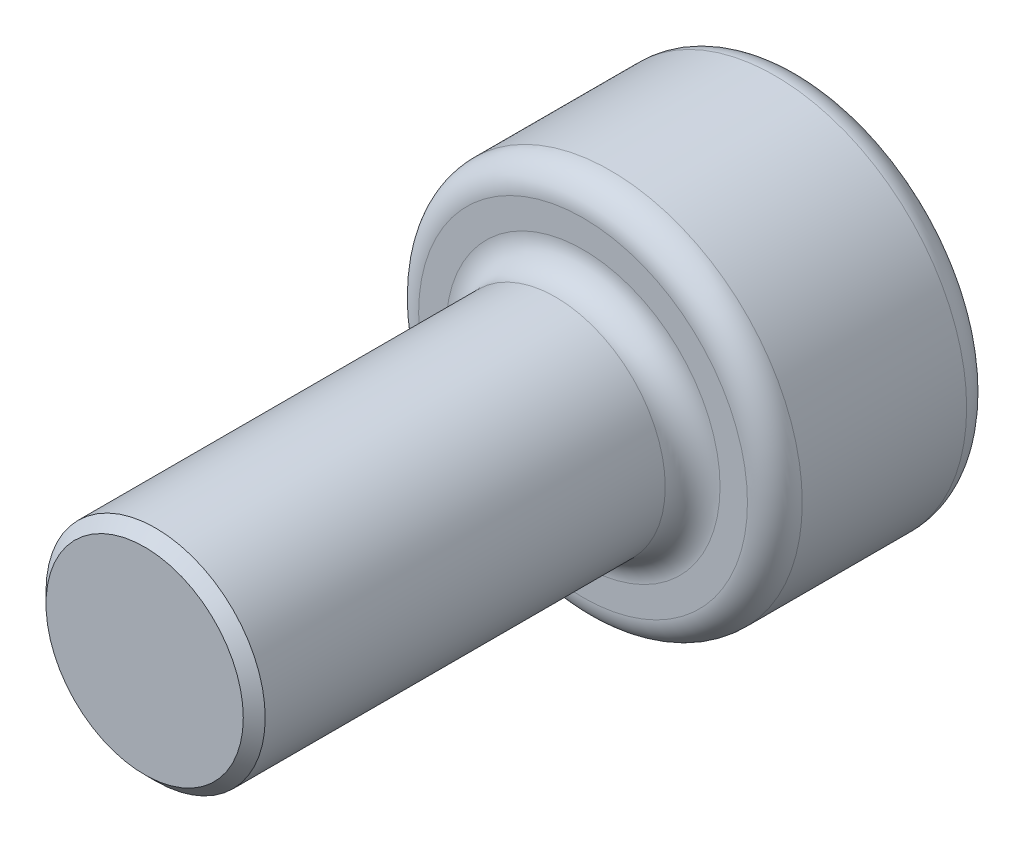
ISO-10303-21;
HEADER;
FILE_DESCRIPTION(('STEP AP214'),'2;1');
FILE_NAME('part.step','',(''),(''),'','','');
FILE_SCHEMA(('AUTOMOTIVE_DESIGN { 1 0 10303 214 1 1 1 1 }'));
ENDSEC;
DATA;
#1=APPLICATION_CONTEXT('core data for automotive mechanical design processes');
#2=APPLICATION_PROTOCOL_DEFINITION('international standard','automotive_design',2000,#1);
#3=PRODUCT_CONTEXT('',#1,'mechanical');
#4=PRODUCT('Part','Part','',(#3));
#5=PRODUCT_RELATED_PRODUCT_CATEGORY('part','',(#4));
#6=PRODUCT_DEFINITION_FORMATION('','',#4);
#7=PRODUCT_DEFINITION_CONTEXT('part definition',#1,'design');
#8=PRODUCT_DEFINITION('design','',#6,#7);
#9=PRODUCT_DEFINITION_SHAPE('','',#8);
#10=(LENGTH_UNIT() NAMED_UNIT(*) SI_UNIT(.MILLI.,.METRE.));
#11=(NAMED_UNIT(*) PLANE_ANGLE_UNIT() SI_UNIT($,.RADIAN.));
#12=(NAMED_UNIT(*) SI_UNIT($,.STERADIAN.) SOLID_ANGLE_UNIT());
#13=UNCERTAINTY_MEASURE_WITH_UNIT(LENGTH_MEASURE(1.E-05),#10,'distance_accuracy_value','');
#14=(GEOMETRIC_REPRESENTATION_CONTEXT(3) GLOBAL_UNCERTAINTY_ASSIGNED_CONTEXT((#13)) GLOBAL_UNIT_ASSIGNED_CONTEXT((#10,
#11,#12)) REPRESENTATION_CONTEXT('',''));
#15=CARTESIAN_POINT('',(0.,0.,0.));
#16=DIRECTION('',(0.,0.,1.));
#17=DIRECTION('',(1.,0.,0.));
#18=AXIS2_PLACEMENT_3D('',#15,#16,#17);
#19=CARTESIAN_POINT('',(0.,0.,4.));
#20=DIRECTION('',(0.,0.,-1.));
#21=DIRECTION('',(-1.,0.,0.));
#22=AXIS2_PLACEMENT_3D('',#19,#20,#21);
#23=CYLINDRICAL_SURFACE('',#22,3.5);
#24=CARTESIAN_POINT('',(0.,0.,3.5));
#25=DIRECTION('',(0.,0.,1.));
#26=DIRECTION('',(1.,0.,0.));
#27=AXIS2_PLACEMENT_3D('',#24,#25,#26);
#28=CIRCLE('',#27,3.5);
#29=CARTESIAN_POINT('',(3.5,0.,3.5));
#30=VERTEX_POINT('',#29);
#31=EDGE_CURVE('E185',#30,#30,#28,.F.);
#32=ORIENTED_EDGE('',*,*,#31,.T.);
#33=EDGE_LOOP('',(#32));
#34=FACE_BOUND('',#33,.T.);
#35=CARTESIAN_POINT('',(0.,0.,0.5));
#36=DIRECTION('',(0.,0.,1.));
#37=DIRECTION('',(1.,0.,0.));
#38=AXIS2_PLACEMENT_3D('',#35,#36,#37);
#39=CIRCLE('',#38,3.5);
#40=CARTESIAN_POINT('',(3.5,0.,0.5));
#41=VERTEX_POINT('',#40);
#42=EDGE_CURVE('E181',#41,#41,#39,.T.);
#43=ORIENTED_EDGE('',*,*,#42,.T.);
#44=EDGE_LOOP('',(#43));
#45=FACE_BOUND('',#44,.T.);
#46=ADVANCED_FACE('F41',(#34,#45),#23,.T.);
#47=CARTESIAN_POINT('',(0.,0.,4.));
#48=DIRECTION('',(0.,0.,1.));
#49=DIRECTION('',(1.,0.,0.));
#50=AXIS2_PLACEMENT_3D('',#47,#48,#49);
#51=PLANE('',#50);
#52=CARTESIAN_POINT('',(0.,0.,4.));
#53=DIRECTION('',(0.,0.,1.));
#54=DIRECTION('',(1.,0.,0.));
#55=AXIS2_PLACEMENT_3D('',#52,#53,#54);
#56=CIRCLE('',#55,3.);
#57=CARTESIAN_POINT('',(3.,0.,4.));
#58=VERTEX_POINT('',#57);
#59=EDGE_CURVE('E177',#58,#58,#56,.T.);
#60=ORIENTED_EDGE('',*,*,#59,.T.);
#61=EDGE_LOOP('',(#60));
#62=FACE_BOUND('',#61,.T.);
#63=CARTESIAN_POINT('',(0.,0.,4.));
#64=DIRECTION('',(0.,0.,1.));
#65=DIRECTION('',(1.,0.,0.));
#66=AXIS2_PLACEMENT_3D('',#63,#64,#65);
#67=CIRCLE('',#66,2.5);
#68=CARTESIAN_POINT('',(2.5,0.,4.));
#69=VERTEX_POINT('',#68);
#70=EDGE_CURVE('E160',#69,#69,#67,.F.);
#71=ORIENTED_EDGE('',*,*,#70,.T.);
#72=EDGE_LOOP('',(#71));
#73=FACE_BOUND('',#72,.T.);
#74=ADVANCED_FACE('F266',(#62,#73),#51,.T.);
#75=CARTESIAN_POINT('',(0.,0.,0.));
#76=DIRECTION('',(0.,0.,1.));
#77=DIRECTION('',(1.,0.,0.));
#78=AXIS2_PLACEMENT_3D('',#75,#76,#77);
#79=PLANE('',#78);
#80=CARTESIAN_POINT('',(0.,0.,0.));
#81=DIRECTION('',(0.,0.,1.));
#82=DIRECTION('',(1.,0.,0.));
#83=AXIS2_PLACEMENT_3D('',#80,#81,#82);
#84=CIRCLE('',#83,3.);
#85=CARTESIAN_POINT('',(3.,0.,0.));
#86=VERTEX_POINT('',#85);
#87=EDGE_CURVE('E212',#86,#86,#84,.F.);
#88=ORIENTED_EDGE('',*,*,#87,.T.);
#89=EDGE_LOOP('',(#88));
#90=FACE_BOUND('',#89,.T.);
#91=DIRECTION('',(0.5,-0.866025403784439,0.));
#92=VECTOR('',#91,1.);
#93=CARTESIAN_POINT('',(1.94855715851499,1.125,0.));
#94=LINE('',#93,#92);
#95=CARTESIAN_POINT('',(2.59807621135332,0.,0.));
#96=VERTEX_POINT('',#95);
#97=CARTESIAN_POINT('',(1.29903810567666,2.25,0.));
#98=VERTEX_POINT('',#97);
#99=EDGE_CURVE('E205',#96,#98,#94,.F.);
#100=ORIENTED_EDGE('',*,*,#99,.T.);
#101=DIRECTION('',(1.,0.,0.));
#102=VECTOR('',#101,1.);
#103=CARTESIAN_POINT('',(0.,2.25,0.));
#104=LINE('',#103,#102);
#105=CARTESIAN_POINT('',(-1.29903810567666,2.25,0.));
#106=VERTEX_POINT('',#105);
#107=EDGE_CURVE('E208',#98,#106,#104,.F.);
#108=ORIENTED_EDGE('',*,*,#107,.T.);
#109=DIRECTION('',(0.5,0.866025403784439,0.));
#110=VECTOR('',#109,1.);
#111=CARTESIAN_POINT('',(-1.94855715851499,1.125,0.));
#112=LINE('',#111,#110);
#113=CARTESIAN_POINT('',(-2.59807621135332,0.,0.));
#114=VERTEX_POINT('',#113);
#115=EDGE_CURVE('E193',#106,#114,#112,.F.);
#116=ORIENTED_EDGE('',*,*,#115,.T.);
#117=DIRECTION('',(-0.5,0.866025403784439,0.));
#118=VECTOR('',#117,1.);
#119=CARTESIAN_POINT('',(-1.94855715851499,-1.125,0.));
#120=LINE('',#119,#118);
#121=CARTESIAN_POINT('',(-1.29903810567666,-2.25,0.));
#122=VERTEX_POINT('',#121);
#123=EDGE_CURVE('E196',#114,#122,#120,.F.);
#124=ORIENTED_EDGE('',*,*,#123,.T.);
#125=DIRECTION('',(-1.,0.,0.));
#126=VECTOR('',#125,1.);
#127=CARTESIAN_POINT('',(0.,-2.25,0.));
#128=LINE('',#127,#126);
#129=CARTESIAN_POINT('',(1.29903810567666,-2.25,0.));
#130=VERTEX_POINT('',#129);
#131=EDGE_CURVE('E199',#122,#130,#128,.F.);
#132=ORIENTED_EDGE('',*,*,#131,.T.);
#133=DIRECTION('',(-0.5,-0.866025403784439,0.));
#134=VECTOR('',#133,1.);
#135=CARTESIAN_POINT('',(1.94855715851499,-1.125,0.));
#136=LINE('',#135,#134);
#137=EDGE_CURVE('E202',#130,#96,#136,.F.);
#138=ORIENTED_EDGE('',*,*,#137,.T.);
#139=EDGE_LOOP('',(#100,#108,#116,#124,#132,#138));
#140=FACE_BOUND('',#139,.T.);
#141=ADVANCED_FACE('F272',(#90,#140),#79,.F.);
#142=CARTESIAN_POINT('',(0.,0.,12.));
#143=DIRECTION('',(0.,0.,-1.));
#144=DIRECTION('',(-1.,0.,0.));
#145=AXIS2_PLACEMENT_3D('',#142,#143,#144);
#146=CYLINDRICAL_SURFACE('',#145,2.);
#147=CARTESIAN_POINT('',(0.,0.,11.8));
#148=DIRECTION('',(0.,0.,1.));
#149=DIRECTION('',(1.,0.,0.));
#150=AXIS2_PLACEMENT_3D('',#147,#148,#149);
#151=CIRCLE('',#150,2.);
#152=CARTESIAN_POINT('',(2.,0.,11.8));
#153=VERTEX_POINT('',#152);
#154=EDGE_CURVE('E11',#153,#153,#151,.F.);
#155=ORIENTED_EDGE('',*,*,#154,.T.);
#156=EDGE_LOOP('',(#155));
#157=FACE_BOUND('',#156,.T.);
#158=CARTESIAN_POINT('',(0.,0.,4.5));
#159=DIRECTION('',(0.,0.,1.));
#160=DIRECTION('',(1.,0.,0.));
#161=AXIS2_PLACEMENT_3D('',#158,#159,#160);
#162=CIRCLE('',#161,2.);
#163=CARTESIAN_POINT('',(2.,0.,4.5));
#164=VERTEX_POINT('',#163);
#165=EDGE_CURVE('E189',#164,#164,#162,.T.);
#166=ORIENTED_EDGE('',*,*,#165,.T.);
#167=EDGE_LOOP('',(#166));
#168=FACE_BOUND('',#167,.T.);
#169=ADVANCED_FACE('F351',(#157,#168),#146,.T.);
#170=CARTESIAN_POINT('',(0.,0.,12.));
#171=DIRECTION('',(0.,0.,1.));
#172=DIRECTION('',(1.,0.,0.));
#173=AXIS2_PLACEMENT_3D('',#170,#171,#172);
#174=PLANE('',#173);
#175=CARTESIAN_POINT('',(0.,0.,12.));
#176=DIRECTION('',(0.,0.,1.));
#177=DIRECTION('',(1.,0.,0.));
#178=AXIS2_PLACEMENT_3D('',#175,#176,#177);
#179=CIRCLE('',#178,1.8);
#180=CARTESIAN_POINT('',(1.8,0.,12.));
#181=VERTEX_POINT('',#180);
#182=EDGE_CURVE('E51',#181,#181,#179,.T.);
#183=ORIENTED_EDGE('',*,*,#182,.T.);
#184=EDGE_LOOP('',(#183));
#185=FACE_BOUND('',#184,.T.);
#186=ADVANCED_FACE('F253',(#185),#174,.T.);
#187=CARTESIAN_POINT('',(-1.01036297108185,-1.75,2.5));
#188=DIRECTION('',(-0.866025403784439,-0.5,0.));
#189=DIRECTION('',(0.5,-0.866025403784439,0.));
#190=AXIS2_PLACEMENT_3D('',#187,#188,#189);
#191=PLANE('',#190);
#192=DIRECTION('',(0.,0.,-1.));
#193=VECTOR('',#192,1.);
#194=CARTESIAN_POINT('',(-1.01036297108185,-1.75,2.5));
#195=LINE('',#194,#193);
#196=CARTESIAN_POINT('',(-1.01036297108185,-1.75,2.5));
#197=VERTEX_POINT('',#196);
#198=CARTESIAN_POINT('',(-1.01036297108185,-1.75,0.5));
#199=VERTEX_POINT('',#198);
#200=EDGE_CURVE('E157',#197,#199,#195,.T.);
#201=ORIENTED_EDGE('',*,*,#200,.T.);
#202=DIRECTION('',(-0.5,0.866025403784439,0.));
#203=VECTOR('',#202,1.);
#204=CARTESIAN_POINT('',(-1.01036297108185,-1.75,0.5));
#205=LINE('',#204,#203);
#206=CARTESIAN_POINT('',(-2.02072594216369,0.,0.5));
#207=VERTEX_POINT('',#206);
#208=EDGE_CURVE('E58',#199,#207,#205,.T.);
#209=ORIENTED_EDGE('',*,*,#208,.T.);
#210=DIRECTION('',(0.,0.,-1.));
#211=VECTOR('',#210,1.);
#212=CARTESIAN_POINT('',(-2.02072594216369,0.,2.5));
#213=LINE('',#212,#211);
#214=CARTESIAN_POINT('',(-2.02072594216369,0.,2.5));
#215=VERTEX_POINT('',#214);
#216=EDGE_CURVE('E113',#215,#207,#213,.T.);
#217=ORIENTED_EDGE('',*,*,#216,.F.);
#218=DIRECTION('',(-0.5,0.866025403784439,0.));
#219=VECTOR('',#218,1.);
#220=CARTESIAN_POINT('',(-1.01036297108185,-1.75,2.5));
#221=LINE('',#220,#219);
#222=EDGE_CURVE('E117',#197,#215,#221,.T.);
#223=ORIENTED_EDGE('',*,*,#222,.F.);
#224=EDGE_LOOP('',(#201,#209,#217,#223));
#225=FACE_BOUND('',#224,.T.);
#226=ADVANCED_FACE('F115',(#225),#191,.F.);
#227=CARTESIAN_POINT('',(1.01036297108185,-1.75,2.5));
#228=DIRECTION('',(0.,-1.,0.));
#229=DIRECTION('',(0.,0.,-1.));
#230=AXIS2_PLACEMENT_3D('',#227,#228,#229);
#231=PLANE('',#230);
#232=DIRECTION('',(0.,0.,-1.));
#233=VECTOR('',#232,1.);
#234=CARTESIAN_POINT('',(1.01036297108185,-1.75,2.5));
#235=LINE('',#234,#233);
#236=CARTESIAN_POINT('',(1.01036297108185,-1.75,2.5));
#237=VERTEX_POINT('',#236);
#238=CARTESIAN_POINT('',(1.01036297108185,-1.75,0.5));
#239=VERTEX_POINT('',#238);
#240=EDGE_CURVE('E161',#237,#239,#235,.T.);
#241=ORIENTED_EDGE('',*,*,#240,.T.);
#242=DIRECTION('',(-1.,0.,0.));
#243=VECTOR('',#242,1.);
#244=CARTESIAN_POINT('',(1.01036297108185,-1.75,0.5));
#245=LINE('',#244,#243);
#246=EDGE_CURVE('E66',#239,#199,#245,.T.);
#247=ORIENTED_EDGE('',*,*,#246,.T.);
#248=ORIENTED_EDGE('',*,*,#200,.F.);
#249=DIRECTION('',(-1.,0.,0.));
#250=VECTOR('',#249,1.);
#251=CARTESIAN_POINT('',(1.01036297108185,-1.75,2.5));
#252=LINE('',#251,#250);
#253=EDGE_CURVE('E123',#237,#197,#252,.T.);
#254=ORIENTED_EDGE('',*,*,#253,.F.);
#255=EDGE_LOOP('',(#241,#247,#248,#254));
#256=FACE_BOUND('',#255,.T.);
#257=ADVANCED_FACE('F332',(#256),#231,.F.);
#258=CARTESIAN_POINT('',(2.02072594216369,0.,2.5));
#259=DIRECTION('',(0.866025403784439,-0.5,0.));
#260=DIRECTION('',(0.5,0.866025403784439,0.));
#261=AXIS2_PLACEMENT_3D('',#258,#259,#260);
#262=PLANE('',#261);
#263=DIRECTION('',(0.,0.,-1.));
#264=VECTOR('',#263,1.);
#265=CARTESIAN_POINT('',(2.02072594216369,0.,2.5));
#266=LINE('',#265,#264);
#267=CARTESIAN_POINT('',(2.02072594216369,0.,2.5));
#268=VERTEX_POINT('',#267);
#269=CARTESIAN_POINT('',(2.02072594216369,0.,0.5));
#270=VERTEX_POINT('',#269);
#271=EDGE_CURVE('E164',#268,#270,#266,.T.);
#272=ORIENTED_EDGE('',*,*,#271,.T.);
#273=DIRECTION('',(-0.5,-0.866025403784439,0.));
#274=VECTOR('',#273,1.);
#275=CARTESIAN_POINT('',(2.02072594216369,0.,0.5));
#276=LINE('',#275,#274);
#277=EDGE_CURVE('E223',#270,#239,#276,.T.);
#278=ORIENTED_EDGE('',*,*,#277,.T.);
#279=ORIENTED_EDGE('',*,*,#240,.F.);
#280=DIRECTION('',(-0.5,-0.866025403784439,0.));
#281=VECTOR('',#280,1.);
#282=CARTESIAN_POINT('',(2.02072594216369,0.,2.5));
#283=LINE('',#282,#281);
#284=EDGE_CURVE('E152',#268,#237,#283,.T.);
#285=ORIENTED_EDGE('',*,*,#284,.F.);
#286=EDGE_LOOP('',(#272,#278,#279,#285));
#287=FACE_BOUND('',#286,.T.);
#288=ADVANCED_FACE('F331',(#287),#262,.F.);
#289=CARTESIAN_POINT('',(1.01036297108185,1.75,2.5));
#290=DIRECTION('',(0.866025403784439,0.5,0.));
#291=DIRECTION('',(-0.5,0.866025403784439,0.));
#292=AXIS2_PLACEMENT_3D('',#289,#290,#291);
#293=PLANE('',#292);
#294=DIRECTION('',(0.,0.,-1.));
#295=VECTOR('',#294,1.);
#296=CARTESIAN_POINT('',(1.01036297108185,1.75,2.5));
#297=LINE('',#296,#295);
#298=CARTESIAN_POINT('',(1.01036297108185,1.75,2.5));
#299=VERTEX_POINT('',#298);
#300=CARTESIAN_POINT('',(1.01036297108185,1.75,0.5));
#301=VERTEX_POINT('',#300);
#302=EDGE_CURVE('E168',#299,#301,#297,.T.);
#303=ORIENTED_EDGE('',*,*,#302,.T.);
#304=DIRECTION('',(0.5,-0.866025403784439,0.));
#305=VECTOR('',#304,1.);
#306=CARTESIAN_POINT('',(1.01036297108185,1.75,0.5));
#307=LINE('',#306,#305);
#308=EDGE_CURVE('E220',#301,#270,#307,.T.);
#309=ORIENTED_EDGE('',*,*,#308,.T.);
#310=ORIENTED_EDGE('',*,*,#271,.F.);
#311=DIRECTION('',(0.5,-0.866025403784439,0.));
#312=VECTOR('',#311,1.);
#313=CARTESIAN_POINT('',(1.01036297108185,1.75,2.5));
#314=LINE('',#313,#312);
#315=EDGE_CURVE('E148',#299,#268,#314,.T.);
#316=ORIENTED_EDGE('',*,*,#315,.F.);
#317=EDGE_LOOP('',(#303,#309,#310,#316));
#318=FACE_BOUND('',#317,.T.);
#319=ADVANCED_FACE('F328',(#318),#293,.F.);
#320=CARTESIAN_POINT('',(-1.01036297108184,1.75,2.5));
#321=DIRECTION('',(0.,1.,0.));
#322=DIRECTION('',(0.,0.,1.));
#323=AXIS2_PLACEMENT_3D('',#320,#321,#322);
#324=PLANE('',#323);
#325=DIRECTION('',(0.,0.,-1.));
#326=VECTOR('',#325,1.);
#327=CARTESIAN_POINT('',(-1.01036297108184,1.75,2.5));
#328=LINE('',#327,#326);
#329=CARTESIAN_POINT('',(-1.01036297108184,1.75,2.5));
#330=VERTEX_POINT('',#329);
#331=CARTESIAN_POINT('',(-1.01036297108184,1.75,0.5));
#332=VERTEX_POINT('',#331);
#333=EDGE_CURVE('E122',#330,#332,#328,.T.);
#334=ORIENTED_EDGE('',*,*,#333,.T.);
#335=DIRECTION('',(1.,0.,0.));
#336=VECTOR('',#335,1.);
#337=CARTESIAN_POINT('',(-1.01036297108184,1.75,0.5));
#338=LINE('',#337,#336);
#339=EDGE_CURVE('E216',#332,#301,#338,.T.);
#340=ORIENTED_EDGE('',*,*,#339,.T.);
#341=ORIENTED_EDGE('',*,*,#302,.F.);
#342=DIRECTION('',(1.,0.,0.));
#343=VECTOR('',#342,1.);
#344=CARTESIAN_POINT('',(-1.01036297108184,1.75,2.5));
#345=LINE('',#344,#343);
#346=EDGE_CURVE('E133',#330,#299,#345,.T.);
#347=ORIENTED_EDGE('',*,*,#346,.F.);
#348=EDGE_LOOP('',(#334,#340,#341,#347));
#349=FACE_BOUND('',#348,.T.);
#350=ADVANCED_FACE('F324',(#349),#324,.F.);
#351=CARTESIAN_POINT('',(-2.02072594216369,0.,2.5));
#352=DIRECTION('',(-0.866025403784439,0.5,0.));
#353=DIRECTION('',(-0.5,-0.866025403784439,0.));
#354=AXIS2_PLACEMENT_3D('',#351,#352,#353);
#355=PLANE('',#354);
#356=ORIENTED_EDGE('',*,*,#216,.T.);
#357=DIRECTION('',(0.5,0.866025403784439,0.));
#358=VECTOR('',#357,1.);
#359=CARTESIAN_POINT('',(-2.02072594216369,0.,0.5));
#360=LINE('',#359,#358);
#361=EDGE_CURVE('E230',#207,#332,#360,.T.);
#362=ORIENTED_EDGE('',*,*,#361,.T.);
#363=ORIENTED_EDGE('',*,*,#333,.F.);
#364=DIRECTION('',(0.5,0.866025403784439,0.));
#365=VECTOR('',#364,1.);
#366=CARTESIAN_POINT('',(-2.02072594216369,0.,2.5));
#367=LINE('',#366,#365);
#368=EDGE_CURVE('E126',#215,#330,#367,.T.);
#369=ORIENTED_EDGE('',*,*,#368,.F.);
#370=EDGE_LOOP('',(#356,#362,#363,#369));
#371=FACE_BOUND('',#370,.T.);
#372=ADVANCED_FACE('F127',(#371),#355,.F.);
#373=CARTESIAN_POINT('',(0.,0.,2.5));
#374=DIRECTION('',(0.,0.,-1.));
#375=DIRECTION('',(-1.,0.,0.));
#376=AXIS2_PLACEMENT_3D('',#373,#374,#375);
#377=PLANE('',#376);
#378=ORIENTED_EDGE('',*,*,#222,.T.);
#379=ORIENTED_EDGE('',*,*,#368,.T.);
#380=ORIENTED_EDGE('',*,*,#346,.T.);
#381=ORIENTED_EDGE('',*,*,#315,.T.);
#382=ORIENTED_EDGE('',*,*,#284,.T.);
#383=ORIENTED_EDGE('',*,*,#253,.T.);
#384=EDGE_LOOP('',(#378,#379,#380,#381,#382,#383));
#385=FACE_BOUND('',#384,.T.);
#386=ADVANCED_FACE('F135',(#385),#377,.T.);
#387=CARTESIAN_POINT('',(0.,0.,3.5));
#388=DIRECTION('',(0.,0.,1.));
#389=DIRECTION('',(1.,0.,0.));
#390=AXIS2_PLACEMENT_3D('',#387,#388,#389);
#391=TOROIDAL_SURFACE('',#390,3.,0.5);
#392=ORIENTED_EDGE('',*,*,#31,.F.);
#393=EDGE_LOOP('',(#392));
#394=FACE_BOUND('',#393,.T.);
#395=ORIENTED_EDGE('',*,*,#59,.F.);
#396=EDGE_LOOP('',(#395));
#397=FACE_BOUND('',#396,.T.);
#398=ADVANCED_FACE('F278',(#394,#397),#391,.T.);
#399=CARTESIAN_POINT('',(0.,0.,4.5));
#400=DIRECTION('',(0.,0.,1.));
#401=DIRECTION('',(1.,0.,0.));
#402=AXIS2_PLACEMENT_3D('',#399,#400,#401);
#403=TOROIDAL_SURFACE('',#402,2.5,0.5);
#404=ORIENTED_EDGE('',*,*,#70,.F.);
#405=EDGE_LOOP('',(#404));
#406=FACE_BOUND('',#405,.T.);
#407=ORIENTED_EDGE('',*,*,#165,.F.);
#408=EDGE_LOOP('',(#407));
#409=FACE_BOUND('',#408,.T.);
#410=ADVANCED_FACE('F281',(#406,#409),#403,.F.);
#411=CARTESIAN_POINT('',(0.,0.,0.5));
#412=DIRECTION('',(0.,0.,1.));
#413=DIRECTION('',(1.,0.,0.));
#414=AXIS2_PLACEMENT_3D('',#411,#412,#413);
#415=TOROIDAL_SURFACE('',#414,3.,0.5);
#416=ORIENTED_EDGE('',*,*,#87,.F.);
#417=EDGE_LOOP('',(#416));
#418=FACE_BOUND('',#417,.T.);
#419=ORIENTED_EDGE('',*,*,#42,.F.);
#420=EDGE_LOOP('',(#419));
#421=FACE_BOUND('',#420,.T.);
#422=ADVANCED_FACE('F285',(#418,#421),#415,.T.);
#423=CARTESIAN_POINT('',(1.01036297108185,-2.25,0.5));
#424=DIRECTION('',(-1.,0.,0.));
#425=DIRECTION('',(0.,0.,1.));
#426=AXIS2_PLACEMENT_3D('',#423,#424,#425);
#427=CYLINDRICAL_SURFACE('',#426,0.5);
#428=CARTESIAN_POINT('',(1.29903810567666,-2.25,0.5));
#429=DIRECTION('',(-0.866025403784439,-0.5,0.));
#430=DIRECTION('',(0.5,-0.866025403784439,0.));
#431=AXIS2_PLACEMENT_3D('',#428,#429,#430);
#432=ELLIPSE('',#431,0.577350269189626,0.5);
#433=EDGE_CURVE('E143',#130,#239,#432,.F.);
#434=ORIENTED_EDGE('',*,*,#433,.F.);
#435=ORIENTED_EDGE('',*,*,#131,.F.);
#436=CARTESIAN_POINT('',(-1.29903810567666,-2.25,0.5));
#437=DIRECTION('',(-0.866025403784438,0.5,0.));
#438=DIRECTION('',(-0.5,-0.866025403784439,0.));
#439=AXIS2_PLACEMENT_3D('',#436,#437,#438);
#440=ELLIPSE('',#439,0.577350269189626,0.5);
#441=EDGE_CURVE('E139',#199,#122,#440,.T.);
#442=ORIENTED_EDGE('',*,*,#441,.F.);
#443=ORIENTED_EDGE('',*,*,#246,.F.);
#444=EDGE_LOOP('',(#434,#435,#442,#443));
#445=FACE_BOUND('',#444,.T.);
#446=ADVANCED_FACE('F288',(#445),#427,.T.);
#447=CARTESIAN_POINT('',(-1.44337567297406,-2.,0.5));
#448=DIRECTION('',(-0.5,0.866025403784439,0.));
#449=DIRECTION('',(-0.866025403784439,-0.5,0.));
#450=AXIS2_PLACEMENT_3D('',#447,#448,#449);
#451=CYLINDRICAL_SURFACE('',#450,0.5);
#452=ORIENTED_EDGE('',*,*,#441,.T.);
#453=ORIENTED_EDGE('',*,*,#123,.F.);
#454=CARTESIAN_POINT('',(-2.59807621135332,0.,0.5));
#455=DIRECTION('',(0.,1.,0.));
#456=DIRECTION('',(-1.,0.,0.));
#457=AXIS2_PLACEMENT_3D('',#454,#455,#456);
#458=ELLIPSE('',#457,0.577350269189626,0.5);
#459=EDGE_CURVE('E243',#207,#114,#458,.T.);
#460=ORIENTED_EDGE('',*,*,#459,.F.);
#461=ORIENTED_EDGE('',*,*,#208,.F.);
#462=EDGE_LOOP('',(#452,#453,#460,#461));
#463=FACE_BOUND('',#462,.T.);
#464=ADVANCED_FACE('F301',(#463),#451,.T.);
#465=CARTESIAN_POINT('',(2.45373864405591,-0.25,0.5));
#466=DIRECTION('',(-0.5,-0.866025403784439,0.));
#467=DIRECTION('',(0.866025403784439,-0.5,0.));
#468=AXIS2_PLACEMENT_3D('',#465,#466,#467);
#469=CYLINDRICAL_SURFACE('',#468,0.5);
#470=ORIENTED_EDGE('',*,*,#433,.T.);
#471=ORIENTED_EDGE('',*,*,#277,.F.);
#472=CARTESIAN_POINT('',(2.59807621135332,0.,0.5));
#473=DIRECTION('',(0.,-1.,0.));
#474=DIRECTION('',(1.,0.,0.));
#475=AXIS2_PLACEMENT_3D('',#472,#473,#474);
#476=ELLIPSE('',#475,0.577350269189626,0.5);
#477=EDGE_CURVE('E239',#96,#270,#476,.F.);
#478=ORIENTED_EDGE('',*,*,#477,.F.);
#479=ORIENTED_EDGE('',*,*,#137,.F.);
#480=EDGE_LOOP('',(#470,#471,#478,#479));
#481=FACE_BOUND('',#480,.T.);
#482=ADVANCED_FACE('F297',(#481),#469,.T.);
#483=CARTESIAN_POINT('',(-2.45373864405591,0.250000000000001,0.5));
#484=DIRECTION('',(0.5,0.866025403784439,0.));
#485=DIRECTION('',(-0.866025403784439,0.5,0.));
#486=AXIS2_PLACEMENT_3D('',#483,#484,#485);
#487=CYLINDRICAL_SURFACE('',#486,0.5);
#488=ORIENTED_EDGE('',*,*,#459,.T.);
#489=ORIENTED_EDGE('',*,*,#115,.F.);
#490=CARTESIAN_POINT('',(-1.29903810567666,2.25,0.5));
#491=DIRECTION('',(0.866025403784439,0.5,0.));
#492=DIRECTION('',(0.5,-0.866025403784439,0.));
#493=AXIS2_PLACEMENT_3D('',#490,#491,#492);
#494=ELLIPSE('',#493,0.577350269189626,0.5);
#495=EDGE_CURVE('E236',#332,#106,#494,.T.);
#496=ORIENTED_EDGE('',*,*,#495,.F.);
#497=ORIENTED_EDGE('',*,*,#361,.F.);
#498=EDGE_LOOP('',(#488,#489,#496,#497));
#499=FACE_BOUND('',#498,.T.);
#500=ADVANCED_FACE('F293',(#499),#487,.T.);
#501=CARTESIAN_POINT('',(1.44337567297406,2.,0.5));
#502=DIRECTION('',(0.5,-0.866025403784439,0.));
#503=DIRECTION('',(0.866025403784439,0.5,0.));
#504=AXIS2_PLACEMENT_3D('',#501,#502,#503);
#505=CYLINDRICAL_SURFACE('',#504,0.5);
#506=ORIENTED_EDGE('',*,*,#477,.T.);
#507=ORIENTED_EDGE('',*,*,#308,.F.);
#508=CARTESIAN_POINT('',(1.29903810567666,2.25,0.5));
#509=DIRECTION('',(0.866025403784439,-0.5,0.));
#510=DIRECTION('',(0.5,0.866025403784439,0.));
#511=AXIS2_PLACEMENT_3D('',#508,#509,#510);
#512=ELLIPSE('',#511,0.577350269189626,0.5);
#513=EDGE_CURVE('E233',#98,#301,#512,.F.);
#514=ORIENTED_EDGE('',*,*,#513,.F.);
#515=ORIENTED_EDGE('',*,*,#99,.F.);
#516=EDGE_LOOP('',(#506,#507,#514,#515));
#517=FACE_BOUND('',#516,.T.);
#518=ADVANCED_FACE('F261',(#517),#505,.T.);
#519=CARTESIAN_POINT('',(-1.01036297108184,2.25,0.5));
#520=DIRECTION('',(1.,0.,0.));
#521=DIRECTION('',(0.,0.,-1.));
#522=AXIS2_PLACEMENT_3D('',#519,#520,#521);
#523=CYLINDRICAL_SURFACE('',#522,0.5);
#524=ORIENTED_EDGE('',*,*,#495,.T.);
#525=ORIENTED_EDGE('',*,*,#107,.F.);
#526=ORIENTED_EDGE('',*,*,#513,.T.);
#527=ORIENTED_EDGE('',*,*,#339,.F.);
#528=EDGE_LOOP('',(#524,#525,#526,#527));
#529=FACE_BOUND('',#528,.T.);
#530=ADVANCED_FACE('F256',(#529),#523,.T.);
#531=CARTESIAN_POINT('',(0.,0.,12.));
#532=DIRECTION('',(0.,0.,-1.));
#533=DIRECTION('',(-1.,0.,0.));
#534=AXIS2_PLACEMENT_3D('',#531,#532,#533);
#535=CONICAL_SURFACE('',#534,1.8,0.785398163397448);
#536=ORIENTED_EDGE('',*,*,#154,.F.);
#537=EDGE_LOOP('',(#536));
#538=FACE_BOUND('',#537,.T.);
#539=ORIENTED_EDGE('',*,*,#182,.F.);
#540=EDGE_LOOP('',(#539));
#541=FACE_BOUND('',#540,.T.);
#542=ADVANCED_FACE('F44',(#538,#541),#535,.T.);
#543=CLOSED_SHELL('',(#46,#74,#141,#169,#186,#226,#257,#288,#319,#350,#372,#386,#398,#410,#422,
#446,#464,#482,#500,#518,#530,#542));
#544=MANIFOLD_SOLID_BREP('B2',#543);
#545=ADVANCED_BREP_SHAPE_REPRESENTATION('',(#18,#544),#14);
#546=SHAPE_DEFINITION_REPRESENTATION(#9,#545);
ENDSEC;
END-ISO-10303-21;
